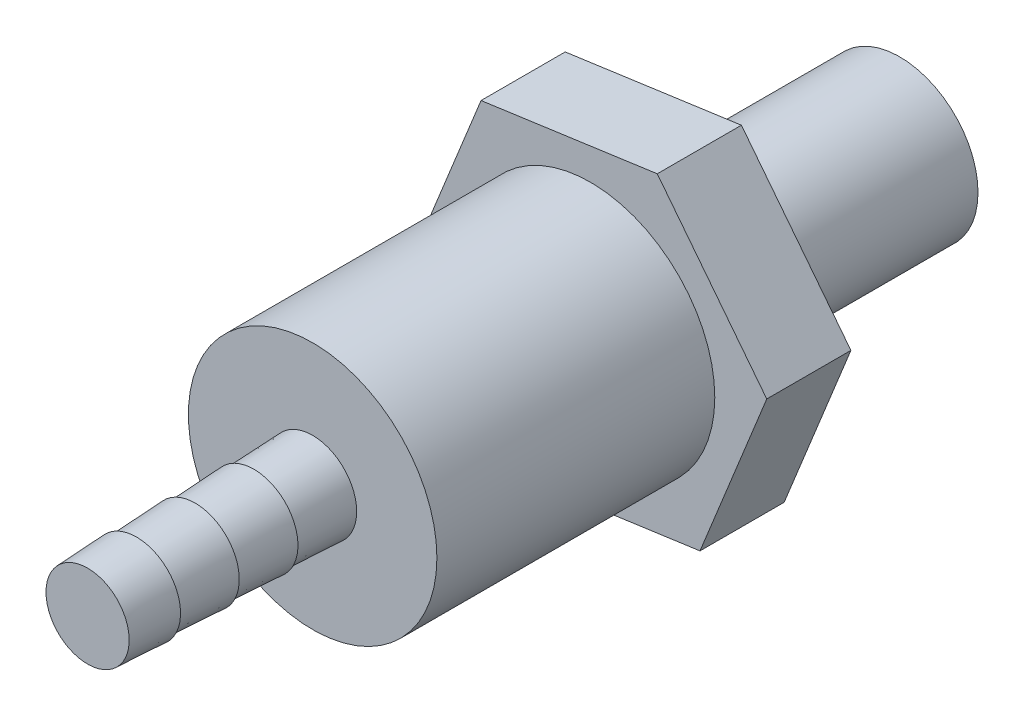
ISO-10303-21;
HEADER;
FILE_DESCRIPTION(('STEP AP214'),'2;1');
FILE_NAME('part.step','',(''),(''),'','','');
FILE_SCHEMA(('AUTOMOTIVE_DESIGN { 1 0 10303 214 1 1 1 1 }'));
ENDSEC;
DATA;
#1=APPLICATION_CONTEXT('core data for automotive mechanical design processes');
#2=APPLICATION_PROTOCOL_DEFINITION('international standard','automotive_design',2000,#1);
#3=PRODUCT_CONTEXT('',#1,'mechanical');
#4=PRODUCT('Part','Part','',(#3));
#5=PRODUCT_RELATED_PRODUCT_CATEGORY('part','',(#4));
#6=PRODUCT_DEFINITION_FORMATION('','',#4);
#7=PRODUCT_DEFINITION_CONTEXT('part definition',#1,'design');
#8=PRODUCT_DEFINITION('design','',#6,#7);
#9=PRODUCT_DEFINITION_SHAPE('','',#8);
#10=(LENGTH_UNIT() NAMED_UNIT(*) SI_UNIT(.MILLI.,.METRE.));
#11=(NAMED_UNIT(*) PLANE_ANGLE_UNIT() SI_UNIT($,.RADIAN.));
#12=(NAMED_UNIT(*) SI_UNIT($,.STERADIAN.) SOLID_ANGLE_UNIT());
#13=UNCERTAINTY_MEASURE_WITH_UNIT(LENGTH_MEASURE(1.E-05),#10,'distance_accuracy_value','');
#14=(GEOMETRIC_REPRESENTATION_CONTEXT(3) GLOBAL_UNCERTAINTY_ASSIGNED_CONTEXT((#13)) GLOBAL_UNIT_ASSIGNED_CONTEXT((#10,
#11,#12)) REPRESENTATION_CONTEXT('',''));
#15=CARTESIAN_POINT('',(0.,0.,0.));
#16=DIRECTION('',(0.,0.,1.));
#17=DIRECTION('',(1.,0.,0.));
#18=AXIS2_PLACEMENT_3D('',#15,#16,#17);
#19=CARTESIAN_POINT('',(3.4110053572521,8.42926701752872,15.8));
#20=DIRECTION('',(0.,0.,1.));
#21=DIRECTION('',(1.,0.,0.));
#22=AXIS2_PLACEMENT_3D('',#19,#20,#21);
#23=PLANE('',#22);
#24=DIRECTION('',(-0.61523068155352,0.78834713703748,0.));
#25=VECTOR('',#24,1.);
#26=CARTESIAN_POINT('',(9.00546205108821,1.26061621693923,15.8));
#27=LINE('',#26,#25);
#28=CARTESIAN_POINT('',(9.00546205108821,1.26061621693923,15.8));
#29=VERTEX_POINT('',#28);
#30=CARTESIAN_POINT('',(3.4110053572521,8.42926701752872,15.8));
#31=VERTEX_POINT('',#30);
#32=EDGE_CURVE('E122',#29,#31,#27,.T.);
#33=ORIENTED_EDGE('',*,*,#32,.T.);
#34=DIRECTION('',(-0.99034398845195,-0.138631830894223,0.));
#35=VECTOR('',#34,1.);
#36=CARTESIAN_POINT('',(3.4110053572521,8.42926701752872,15.8));
#37=LINE('',#36,#35);
#38=CARTESIAN_POINT('',(-5.59445669383611,7.16865080058949,15.8));
#39=VERTEX_POINT('',#38);
#40=EDGE_CURVE('E99',#31,#39,#37,.T.);
#41=ORIENTED_EDGE('',*,*,#40,.T.);
#42=DIRECTION('',(-0.37511330689843,-0.926978967931703,0.));
#43=VECTOR('',#42,1.);
#44=CARTESIAN_POINT('',(-5.59445669383611,7.16865080058949,15.8));
#45=LINE('',#44,#43);
#46=CARTESIAN_POINT('',(-9.00546205108821,-1.26061621693923,15.8));
#47=VERTEX_POINT('',#46);
#48=EDGE_CURVE('E125',#39,#47,#45,.T.);
#49=ORIENTED_EDGE('',*,*,#48,.T.);
#50=DIRECTION('',(0.61523068155352,-0.78834713703748,0.));
#51=VECTOR('',#50,1.);
#52=CARTESIAN_POINT('',(-9.00546205108821,-1.26061621693923,15.8));
#53=LINE('',#52,#51);
#54=CARTESIAN_POINT('',(-3.4110053572521,-8.42926701752872,15.8));
#55=VERTEX_POINT('',#54);
#56=EDGE_CURVE('E127',#47,#55,#53,.T.);
#57=ORIENTED_EDGE('',*,*,#56,.T.);
#58=DIRECTION('',(0.99034398845195,0.138631830894223,0.));
#59=VECTOR('',#58,1.);
#60=CARTESIAN_POINT('',(-3.4110053572521,-8.42926701752872,15.8));
#61=LINE('',#60,#59);
#62=CARTESIAN_POINT('',(5.59445669383611,-7.16865080058949,15.8));
#63=VERTEX_POINT('',#62);
#64=EDGE_CURVE('E50',#55,#63,#61,.T.);
#65=ORIENTED_EDGE('',*,*,#64,.T.);
#66=DIRECTION('',(0.37511330689843,0.926978967931703,0.));
#67=VECTOR('',#66,1.);
#68=CARTESIAN_POINT('',(5.59445669383611,-7.16865080058949,15.8));
#69=LINE('',#68,#67);
#70=EDGE_CURVE('E45',#63,#29,#69,.T.);
#71=ORIENTED_EDGE('',*,*,#70,.T.);
#72=EDGE_LOOP('',(#33,#41,#49,#57,#65,#71));
#73=FACE_BOUND('',#72,.T.);
#74=CARTESIAN_POINT('',(0.,0.,15.8));
#75=DIRECTION('',(0.,0.,1.));
#76=DIRECTION('',(1.,0.,0.));
#77=AXIS2_PLACEMENT_3D('',#74,#75,#76);
#78=CIRCLE('',#77,6.35);
#79=CARTESIAN_POINT('',(6.35,0.,15.8));
#80=VERTEX_POINT('',#79);
#81=EDGE_CURVE('E111',#80,#80,#78,.T.);
#82=ORIENTED_EDGE('',*,*,#81,.F.);
#83=EDGE_LOOP('',(#82));
#84=FACE_BOUND('',#83,.T.);
#85=ADVANCED_FACE('F30',(#73,#84),#23,.T.);
#86=CARTESIAN_POINT('',(0.,0.,11.5));
#87=DIRECTION('',(0.,0.,-1.));
#88=DIRECTION('',(-1.,0.,0.));
#89=AXIS2_PLACEMENT_3D('',#86,#87,#88);
#90=CYLINDRICAL_SURFACE('',#89,4.);
#91=CARTESIAN_POINT('',(0.,0.,11.5));
#92=DIRECTION('',(0.,0.,1.));
#93=DIRECTION('',(1.,0.,0.));
#94=AXIS2_PLACEMENT_3D('',#91,#92,#93);
#95=CIRCLE('',#94,4.);
#96=CARTESIAN_POINT('',(4.,0.,11.5));
#97=VERTEX_POINT('',#96);
#98=EDGE_CURVE('E38',#97,#97,#95,.T.);
#99=ORIENTED_EDGE('',*,*,#98,.F.);
#100=EDGE_LOOP('',(#99));
#101=FACE_BOUND('',#100,.T.);
#102=CARTESIAN_POINT('',(0.,0.,0.));
#103=DIRECTION('',(0.,0.,1.));
#104=DIRECTION('',(1.,0.,0.));
#105=AXIS2_PLACEMENT_3D('',#102,#103,#104);
#106=CIRCLE('',#105,4.);
#107=CARTESIAN_POINT('',(4.,0.,0.));
#108=VERTEX_POINT('',#107);
#109=EDGE_CURVE('E102',#108,#108,#106,.T.);
#110=ORIENTED_EDGE('',*,*,#109,.T.);
#111=EDGE_LOOP('',(#110));
#112=FACE_BOUND('',#111,.T.);
#113=ADVANCED_FACE('F32',(#101,#112),#90,.T.);
#114=CARTESIAN_POINT('',(0.,0.,0.));
#115=DIRECTION('',(0.,0.,1.));
#116=DIRECTION('',(1.,0.,0.));
#117=AXIS2_PLACEMENT_3D('',#114,#115,#116);
#118=PLANE('',#117);
#119=ORIENTED_EDGE('',*,*,#109,.F.);
#120=EDGE_LOOP('',(#119));
#121=FACE_BOUND('',#120,.T.);
#122=ADVANCED_FACE('F148',(#121),#118,.F.);
#123=CARTESIAN_POINT('',(3.4110053572521,8.42926701752872,11.5));
#124=DIRECTION('',(0.,0.,1.));
#125=DIRECTION('',(1.,0.,0.));
#126=AXIS2_PLACEMENT_3D('',#123,#124,#125);
#127=PLANE('',#126);
#128=DIRECTION('',(-0.61523068155352,0.78834713703748,0.));
#129=VECTOR('',#128,1.);
#130=CARTESIAN_POINT('',(9.00546205108821,1.26061621693923,11.5));
#131=LINE('',#130,#129);
#132=CARTESIAN_POINT('',(9.00546205108821,1.26061621693923,11.5));
#133=VERTEX_POINT('',#132);
#134=CARTESIAN_POINT('',(3.4110053572521,8.42926701752872,11.5));
#135=VERTEX_POINT('',#134);
#136=EDGE_CURVE('E89',#133,#135,#131,.T.);
#137=ORIENTED_EDGE('',*,*,#136,.F.);
#138=DIRECTION('',(0.37511330689843,0.926978967931703,0.));
#139=VECTOR('',#138,1.);
#140=CARTESIAN_POINT('',(5.59445669383611,-7.16865080058949,11.5));
#141=LINE('',#140,#139);
#142=CARTESIAN_POINT('',(5.59445669383611,-7.16865080058949,11.5));
#143=VERTEX_POINT('',#142);
#144=EDGE_CURVE('E120',#143,#133,#141,.T.);
#145=ORIENTED_EDGE('',*,*,#144,.F.);
#146=DIRECTION('',(0.99034398845195,0.138631830894223,0.));
#147=VECTOR('',#146,1.);
#148=CARTESIAN_POINT('',(-3.4110053572521,-8.42926701752872,11.5));
#149=LINE('',#148,#147);
#150=CARTESIAN_POINT('',(-3.4110053572521,-8.42926701752872,11.5));
#151=VERTEX_POINT('',#150);
#152=EDGE_CURVE('E118',#151,#143,#149,.T.);
#153=ORIENTED_EDGE('',*,*,#152,.F.);
#154=DIRECTION('',(0.61523068155352,-0.78834713703748,0.));
#155=VECTOR('',#154,1.);
#156=CARTESIAN_POINT('',(-9.00546205108821,-1.26061621693923,11.5));
#157=LINE('',#156,#155);
#158=CARTESIAN_POINT('',(-9.00546205108821,-1.26061621693923,11.5));
#159=VERTEX_POINT('',#158);
#160=EDGE_CURVE('E116',#159,#151,#157,.T.);
#161=ORIENTED_EDGE('',*,*,#160,.F.);
#162=DIRECTION('',(-0.37511330689843,-0.926978967931703,0.));
#163=VECTOR('',#162,1.);
#164=CARTESIAN_POINT('',(-5.59445669383611,7.16865080058949,11.5));
#165=LINE('',#164,#163);
#166=CARTESIAN_POINT('',(-5.59445669383611,7.16865080058949,11.5));
#167=VERTEX_POINT('',#166);
#168=EDGE_CURVE('E91',#167,#159,#165,.T.);
#169=ORIENTED_EDGE('',*,*,#168,.F.);
#170=DIRECTION('',(-0.99034398845195,-0.138631830894223,0.));
#171=VECTOR('',#170,1.);
#172=CARTESIAN_POINT('',(3.4110053572521,8.42926701752872,11.5));
#173=LINE('',#172,#171);
#174=EDGE_CURVE('E83',#135,#167,#173,.T.);
#175=ORIENTED_EDGE('',*,*,#174,.F.);
#176=EDGE_LOOP('',(#137,#145,#153,#161,#169,#175));
#177=FACE_BOUND('',#176,.T.);
#178=ORIENTED_EDGE('',*,*,#98,.T.);
#179=EDGE_LOOP('',(#178));
#180=FACE_BOUND('',#179,.T.);
#181=ADVANCED_FACE('F85',(#177,#180),#127,.F.);
#182=CARTESIAN_POINT('',(9.00546205108821,1.26061621693923,15.8));
#183=DIRECTION('',(-0.78834713703748,-0.61523068155352,0.));
#184=DIRECTION('',(0.61523068155352,-0.78834713703748,0.));
#185=AXIS2_PLACEMENT_3D('',#182,#183,#184);
#186=PLANE('',#185);
#187=ORIENTED_EDGE('',*,*,#136,.T.);
#188=DIRECTION('',(0.,0.,-1.));
#189=VECTOR('',#188,1.);
#190=CARTESIAN_POINT('',(3.4110053572521,8.42926701752872,15.8));
#191=LINE('',#190,#189);
#192=EDGE_CURVE('E97',#31,#135,#191,.T.);
#193=ORIENTED_EDGE('',*,*,#192,.F.);
#194=ORIENTED_EDGE('',*,*,#32,.F.);
#195=DIRECTION('',(0.,0.,-1.));
#196=VECTOR('',#195,1.);
#197=CARTESIAN_POINT('',(9.00546205108821,1.26061621693923,15.8));
#198=LINE('',#197,#196);
#199=EDGE_CURVE('E107',#29,#133,#198,.T.);
#200=ORIENTED_EDGE('',*,*,#199,.T.);
#201=EDGE_LOOP('',(#187,#193,#194,#200));
#202=FACE_BOUND('',#201,.T.);
#203=ADVANCED_FACE('F106',(#202),#186,.F.);
#204=CARTESIAN_POINT('',(3.4110053572521,8.42926701752872,15.8));
#205=DIRECTION('',(0.138631830894223,-0.99034398845195,0.));
#206=DIRECTION('',(0.99034398845195,0.138631830894223,0.));
#207=AXIS2_PLACEMENT_3D('',#204,#205,#206);
#208=PLANE('',#207);
#209=ORIENTED_EDGE('',*,*,#174,.T.);
#210=DIRECTION('',(0.,0.,-1.));
#211=VECTOR('',#210,1.);
#212=CARTESIAN_POINT('',(-5.59445669383611,7.16865080058949,15.8));
#213=LINE('',#212,#211);
#214=EDGE_CURVE('E103',#39,#167,#213,.T.);
#215=ORIENTED_EDGE('',*,*,#214,.F.);
#216=ORIENTED_EDGE('',*,*,#40,.F.);
#217=ORIENTED_EDGE('',*,*,#192,.T.);
#218=EDGE_LOOP('',(#209,#215,#216,#217));
#219=FACE_BOUND('',#218,.T.);
#220=ADVANCED_FACE('F98',(#219),#208,.F.);
#221=CARTESIAN_POINT('',(-5.59445669383611,7.16865080058949,15.8));
#222=DIRECTION('',(0.926978967931703,-0.37511330689843,0.));
#223=DIRECTION('',(0.37511330689843,0.926978967931703,0.));
#224=AXIS2_PLACEMENT_3D('',#221,#222,#223);
#225=PLANE('',#224);
#226=ORIENTED_EDGE('',*,*,#168,.T.);
#227=DIRECTION('',(0.,0.,-1.));
#228=VECTOR('',#227,1.);
#229=CARTESIAN_POINT('',(-9.00546205108821,-1.26061621693923,15.8));
#230=LINE('',#229,#228);
#231=EDGE_CURVE('E138',#47,#159,#230,.T.);
#232=ORIENTED_EDGE('',*,*,#231,.F.);
#233=ORIENTED_EDGE('',*,*,#48,.F.);
#234=ORIENTED_EDGE('',*,*,#214,.T.);
#235=EDGE_LOOP('',(#226,#232,#233,#234));
#236=FACE_BOUND('',#235,.T.);
#237=ADVANCED_FACE('F176',(#236),#225,.F.);
#238=CARTESIAN_POINT('',(-9.00546205108821,-1.26061621693923,15.8));
#239=DIRECTION('',(0.78834713703748,0.61523068155352,0.));
#240=DIRECTION('',(-0.61523068155352,0.78834713703748,0.));
#241=AXIS2_PLACEMENT_3D('',#238,#239,#240);
#242=PLANE('',#241);
#243=ORIENTED_EDGE('',*,*,#160,.T.);
#244=DIRECTION('',(0.,0.,-1.));
#245=VECTOR('',#244,1.);
#246=CARTESIAN_POINT('',(-3.4110053572521,-8.42926701752872,15.8));
#247=LINE('',#246,#245);
#248=EDGE_CURVE('E135',#55,#151,#247,.T.);
#249=ORIENTED_EDGE('',*,*,#248,.F.);
#250=ORIENTED_EDGE('',*,*,#56,.F.);
#251=ORIENTED_EDGE('',*,*,#231,.T.);
#252=EDGE_LOOP('',(#243,#249,#250,#251));
#253=FACE_BOUND('',#252,.T.);
#254=ADVANCED_FACE('F172',(#253),#242,.F.);
#255=CARTESIAN_POINT('',(-3.4110053572521,-8.42926701752872,15.8));
#256=DIRECTION('',(-0.138631830894223,0.99034398845195,0.));
#257=DIRECTION('',(-0.99034398845195,-0.138631830894223,0.));
#258=AXIS2_PLACEMENT_3D('',#255,#256,#257);
#259=PLANE('',#258);
#260=ORIENTED_EDGE('',*,*,#152,.T.);
#261=DIRECTION('',(0.,0.,-1.));
#262=VECTOR('',#261,1.);
#263=CARTESIAN_POINT('',(5.59445669383611,-7.16865080058949,15.8));
#264=LINE('',#263,#262);
#265=EDGE_CURVE('E132',#63,#143,#264,.T.);
#266=ORIENTED_EDGE('',*,*,#265,.F.);
#267=ORIENTED_EDGE('',*,*,#64,.F.);
#268=ORIENTED_EDGE('',*,*,#248,.T.);
#269=EDGE_LOOP('',(#260,#266,#267,#268));
#270=FACE_BOUND('',#269,.T.);
#271=ADVANCED_FACE('F168',(#270),#259,.F.);
#272=CARTESIAN_POINT('',(5.59445669383611,-7.16865080058949,15.8));
#273=DIRECTION('',(-0.926978967931703,0.37511330689843,0.));
#274=DIRECTION('',(-0.37511330689843,-0.926978967931703,0.));
#275=AXIS2_PLACEMENT_3D('',#272,#273,#274);
#276=PLANE('',#275);
#277=ORIENTED_EDGE('',*,*,#144,.T.);
#278=ORIENTED_EDGE('',*,*,#199,.F.);
#279=ORIENTED_EDGE('',*,*,#70,.F.);
#280=ORIENTED_EDGE('',*,*,#265,.T.);
#281=EDGE_LOOP('',(#277,#278,#279,#280));
#282=FACE_BOUND('',#281,.T.);
#283=ADVANCED_FACE('F164',(#282),#276,.F.);
#284=CARTESIAN_POINT('',(0.,0.,30.));
#285=DIRECTION('',(0.,0.,-1.));
#286=DIRECTION('',(-1.,0.,0.));
#287=AXIS2_PLACEMENT_3D('',#284,#285,#286);
#288=CYLINDRICAL_SURFACE('',#287,6.35);
#289=CARTESIAN_POINT('',(0.,0.,30.));
#290=DIRECTION('',(0.,0.,1.));
#291=DIRECTION('',(1.,0.,0.));
#292=AXIS2_PLACEMENT_3D('',#289,#290,#291);
#293=CIRCLE('',#292,6.35);
#294=CARTESIAN_POINT('',(6.35,0.,30.));
#295=VERTEX_POINT('',#294);
#296=EDGE_CURVE('E108',#295,#295,#293,.T.);
#297=ORIENTED_EDGE('',*,*,#296,.F.);
#298=EDGE_LOOP('',(#297));
#299=FACE_BOUND('',#298,.T.);
#300=ORIENTED_EDGE('',*,*,#81,.T.);
#301=EDGE_LOOP('',(#300));
#302=FACE_BOUND('',#301,.T.);
#303=ADVANCED_FACE('F167',(#299,#302),#288,.T.);
#304=CARTESIAN_POINT('',(0.,0.,30.));
#305=DIRECTION('',(0.,0.,1.));
#306=DIRECTION('',(1.,0.,0.));
#307=AXIS2_PLACEMENT_3D('',#304,#305,#306);
#308=PLANE('',#307);
#309=CARTESIAN_POINT('',(0.,0.,30.));
#310=DIRECTION('',(0.,0.,1.));
#311=DIRECTION('',(1.,0.,0.));
#312=AXIS2_PLACEMENT_3D('',#309,#310,#311);
#313=CIRCLE('',#312,2.25);
#314=CARTESIAN_POINT('',(2.25,0.,30.));
#315=VERTEX_POINT('',#314);
#316=EDGE_CURVE('E11',#315,#315,#313,.T.);
#317=ORIENTED_EDGE('',*,*,#316,.F.);
#318=EDGE_LOOP('',(#317));
#319=FACE_BOUND('',#318,.T.);
#320=ORIENTED_EDGE('',*,*,#296,.T.);
#321=EDGE_LOOP('',(#320));
#322=FACE_BOUND('',#321,.T.);
#323=ADVANCED_FACE('F213',(#319,#322),#308,.T.);
#324=CARTESIAN_POINT('',(0.,0.,33.));
#325=DIRECTION('',(0.,0.,-1.));
#326=DIRECTION('',(-1.,0.,0.));
#327=AXIS2_PLACEMENT_3D('',#324,#325,#326);
#328=CONICAL_SURFACE('',#327,2.25,0.0499583957219428);
#329=CARTESIAN_POINT('',(0.,0.,36.));
#330=DIRECTION('',(0.,0.,-1.));
#331=DIRECTION('',(-1.,0.,0.));
#332=AXIS2_PLACEMENT_3D('',#329,#330,#331);
#333=CIRCLE('',#332,2.1);
#334=CARTESIAN_POINT('',(-2.1,0.,36.));
#335=VERTEX_POINT('',#334);
#336=EDGE_CURVE('E359',#335,#335,#333,.T.);
#337=ORIENTED_EDGE('',*,*,#336,.T.);
#338=EDGE_LOOP('',(#337));
#339=FACE_BOUND('',#338,.T.);
#340=CARTESIAN_POINT('',(0.,0.,33.));
#341=DIRECTION('',(0.,0.,-1.));
#342=DIRECTION('',(-1.,0.,0.));
#343=AXIS2_PLACEMENT_3D('',#340,#341,#342);
#344=CIRCLE('',#343,2.25);
#345=CARTESIAN_POINT('',(-2.25,0.,33.));
#346=VERTEX_POINT('',#345);
#347=EDGE_CURVE('E340',#346,#346,#344,.T.);
#348=ORIENTED_EDGE('',*,*,#347,.F.);
#349=EDGE_LOOP('',(#348));
#350=FACE_BOUND('',#349,.T.);
#351=ADVANCED_FACE('F220',(#339,#350),#328,.T.);
#352=CARTESIAN_POINT('',(-2.25,0.,36.));
#353=DIRECTION('',(0.,0.,-1.));
#354=DIRECTION('',(-1.,0.,0.));
#355=AXIS2_PLACEMENT_3D('',#352,#353,#354);
#356=PLANE('',#355);
#357=CARTESIAN_POINT('',(0.,0.,36.));
#358=DIRECTION('',(0.,0.,-1.));
#359=DIRECTION('',(-1.,0.,0.));
#360=AXIS2_PLACEMENT_3D('',#357,#358,#359);
#361=CIRCLE('',#360,2.25);
#362=CARTESIAN_POINT('',(-2.25,0.,36.));
#363=VERTEX_POINT('',#362);
#364=EDGE_CURVE('E356',#363,#363,#361,.T.);
#365=ORIENTED_EDGE('',*,*,#364,.T.);
#366=EDGE_LOOP('',(#365));
#367=FACE_BOUND('',#366,.T.);
#368=ORIENTED_EDGE('',*,*,#336,.F.);
#369=EDGE_LOOP('',(#368));
#370=FACE_BOUND('',#369,.T.);
#371=ADVANCED_FACE('F228',(#367,#370),#356,.T.);
#372=CARTESIAN_POINT('',(0.,0.,36.));
#373=DIRECTION('',(0.,0.,-1.));
#374=DIRECTION('',(-1.,0.,0.));
#375=AXIS2_PLACEMENT_3D('',#372,#373,#374);
#376=CONICAL_SURFACE('',#375,2.25,0.0499583957219428);
#377=CARTESIAN_POINT('',(0.,0.,39.));
#378=DIRECTION('',(0.,0.,-1.));
#379=DIRECTION('',(-1.,0.,0.));
#380=AXIS2_PLACEMENT_3D('',#377,#378,#379);
#381=CIRCLE('',#380,2.1);
#382=CARTESIAN_POINT('',(-2.1,0.,39.));
#383=VERTEX_POINT('',#382);
#384=EDGE_CURVE('E353',#383,#383,#381,.T.);
#385=ORIENTED_EDGE('',*,*,#384,.T.);
#386=EDGE_LOOP('',(#385));
#387=FACE_BOUND('',#386,.T.);
#388=ORIENTED_EDGE('',*,*,#364,.F.);
#389=EDGE_LOOP('',(#388));
#390=FACE_BOUND('',#389,.T.);
#391=ADVANCED_FACE('F236',(#387,#390),#376,.T.);
#392=CARTESIAN_POINT('',(-2.25,0.,39.));
#393=DIRECTION('',(0.,0.,-1.));
#394=DIRECTION('',(-1.,0.,0.));
#395=AXIS2_PLACEMENT_3D('',#392,#393,#394);
#396=PLANE('',#395);
#397=CARTESIAN_POINT('',(0.,0.,39.));
#398=DIRECTION('',(0.,0.,-1.));
#399=DIRECTION('',(-1.,0.,0.));
#400=AXIS2_PLACEMENT_3D('',#397,#398,#399);
#401=CIRCLE('',#400,2.25);
#402=CARTESIAN_POINT('',(-2.25,0.,39.));
#403=VERTEX_POINT('',#402);
#404=EDGE_CURVE('E347',#403,#403,#401,.T.);
#405=ORIENTED_EDGE('',*,*,#404,.T.);
#406=EDGE_LOOP('',(#405));
#407=FACE_BOUND('',#406,.T.);
#408=ORIENTED_EDGE('',*,*,#384,.F.);
#409=EDGE_LOOP('',(#408));
#410=FACE_BOUND('',#409,.T.);
#411=ADVANCED_FACE('F244',(#407,#410),#396,.T.);
#412=CARTESIAN_POINT('',(0.,0.,39.));
#413=DIRECTION('',(0.,0.,-1.));
#414=DIRECTION('',(-1.,0.,0.));
#415=AXIS2_PLACEMENT_3D('',#412,#413,#414);
#416=CONICAL_SURFACE('',#415,2.25,0.0499583957219428);
#417=CARTESIAN_POINT('',(0.,0.,41.5));
#418=DIRECTION('',(0.,0.,-1.));
#419=DIRECTION('',(-1.,0.,0.));
#420=AXIS2_PLACEMENT_3D('',#417,#418,#419);
#421=CIRCLE('',#420,2.125);
#422=CARTESIAN_POINT('',(-2.125,0.,41.5));
#423=VERTEX_POINT('',#422);
#424=EDGE_CURVE('E344',#423,#423,#421,.T.);
#425=ORIENTED_EDGE('',*,*,#424,.T.);
#426=EDGE_LOOP('',(#425));
#427=FACE_BOUND('',#426,.T.);
#428=ORIENTED_EDGE('',*,*,#404,.F.);
#429=EDGE_LOOP('',(#428));
#430=FACE_BOUND('',#429,.T.);
#431=ADVANCED_FACE('F252',(#427,#430),#416,.T.);
#432=CARTESIAN_POINT('',(-2.125,0.,41.5));
#433=DIRECTION('',(0.,0.,1.));
#434=DIRECTION('',(1.,0.,0.));
#435=AXIS2_PLACEMENT_3D('',#432,#433,#434);
#436=PLANE('',#435);
#437=ORIENTED_EDGE('',*,*,#424,.F.);
#438=EDGE_LOOP('',(#437));
#439=FACE_BOUND('',#438,.T.);
#440=ADVANCED_FACE('F260',(#439),#436,.T.);
#441=CARTESIAN_POINT('',(0.,0.,30.));
#442=DIRECTION('',(0.,0.,-1.));
#443=DIRECTION('',(-1.,0.,0.));
#444=AXIS2_PLACEMENT_3D('',#441,#442,#443);
#445=CONICAL_SURFACE('',#444,2.25,0.0416425790985884);
#446=CARTESIAN_POINT('',(0.,0.,33.));
#447=DIRECTION('',(0.,0.,-1.));
#448=DIRECTION('',(-1.,0.,0.));
#449=AXIS2_PLACEMENT_3D('',#446,#447,#448);
#450=CIRCLE('',#449,2.125);
#451=CARTESIAN_POINT('',(-2.125,0.,33.));
#452=VERTEX_POINT('',#451);
#453=EDGE_CURVE('E343',#452,#452,#450,.T.);
#454=ORIENTED_EDGE('',*,*,#453,.T.);
#455=EDGE_LOOP('',(#454));
#456=FACE_BOUND('',#455,.T.);
#457=ORIENTED_EDGE('',*,*,#316,.T.);
#458=EDGE_LOOP('',(#457));
#459=FACE_BOUND('',#458,.T.);
#460=ADVANCED_FACE('F268',(#456,#459),#445,.T.);
#461=CARTESIAN_POINT('',(-2.25,0.,33.));
#462=DIRECTION('',(0.,0.,-1.));
#463=DIRECTION('',(-1.,0.,0.));
#464=AXIS2_PLACEMENT_3D('',#461,#462,#463);
#465=PLANE('',#464);
#466=ORIENTED_EDGE('',*,*,#347,.T.);
#467=EDGE_LOOP('',(#466));
#468=FACE_BOUND('',#467,.T.);
#469=ORIENTED_EDGE('',*,*,#453,.F.);
#470=EDGE_LOOP('',(#469));
#471=FACE_BOUND('',#470,.T.);
#472=ADVANCED_FACE('F276',(#468,#471),#465,.T.);
#473=CLOSED_SHELL('',(#85,#113,#122,#181,#203,#220,#237,#254,#271,#283,#303,#323,#351,#371,#391,
#411,#431,#440,#460,#472));
#474=MANIFOLD_SOLID_BREP('B2',#473);
#475=ADVANCED_BREP_SHAPE_REPRESENTATION('',(#18,#474),#14);
#476=SHAPE_DEFINITION_REPRESENTATION(#9,#475);
ENDSEC;
END-ISO-10303-21;
